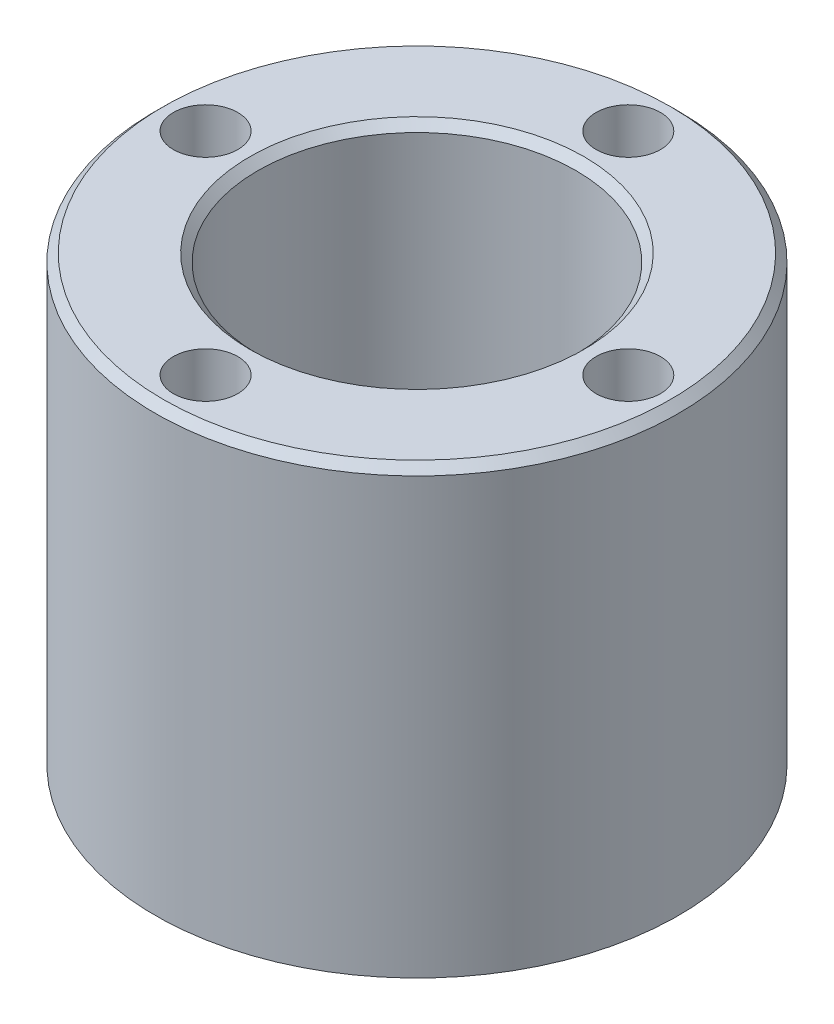
ISO-10303-21;
HEADER;
FILE_DESCRIPTION(('STEP AP214'),'2;1');
FILE_NAME('part.step','',(''),(''),'','','');
FILE_SCHEMA(('AUTOMOTIVE_DESIGN { 1 0 10303 214 1 1 1 1 }'));
ENDSEC;
DATA;
#1=APPLICATION_CONTEXT('core data for automotive mechanical design processes');
#2=APPLICATION_PROTOCOL_DEFINITION('international standard','automotive_design',2000,#1);
#3=PRODUCT_CONTEXT('',#1,'mechanical');
#4=PRODUCT('Part','Part','',(#3));
#5=PRODUCT_RELATED_PRODUCT_CATEGORY('part','',(#4));
#6=PRODUCT_DEFINITION_FORMATION('','',#4);
#7=PRODUCT_DEFINITION_CONTEXT('part definition',#1,'design');
#8=PRODUCT_DEFINITION('design','',#6,#7);
#9=PRODUCT_DEFINITION_SHAPE('','',#8);
#10=(LENGTH_UNIT() NAMED_UNIT(*) SI_UNIT(.MILLI.,.METRE.));
#11=(NAMED_UNIT(*) PLANE_ANGLE_UNIT() SI_UNIT($,.RADIAN.));
#12=(NAMED_UNIT(*) SI_UNIT($,.STERADIAN.) SOLID_ANGLE_UNIT());
#13=UNCERTAINTY_MEASURE_WITH_UNIT(LENGTH_MEASURE(1.E-05),#10,'distance_accuracy_value','');
#14=(GEOMETRIC_REPRESENTATION_CONTEXT(3) GLOBAL_UNCERTAINTY_ASSIGNED_CONTEXT((#13)) GLOBAL_UNIT_ASSIGNED_CONTEXT((#10,
#11,#12)) REPRESENTATION_CONTEXT('',''));
#15=CARTESIAN_POINT('',(0.,0.,0.));
#16=DIRECTION('',(0.,0.,1.));
#17=DIRECTION('',(1.,0.,0.));
#18=AXIS2_PLACEMENT_3D('',#15,#16,#17);
#19=CARTESIAN_POINT('',(0.,85.,-52.5));
#20=DIRECTION('',(0.,-1.,0.));
#21=DIRECTION('',(0.,0.,-1.));
#22=AXIS2_PLACEMENT_3D('',#19,#20,#21);
#23=PLANE('',#22);
#24=CARTESIAN_POINT('',(0.,85.,-52.5));
#25=DIRECTION('',(0.,1.,0.));
#26=DIRECTION('',(0.,0.,1.));
#27=AXIS2_PLACEMENT_3D('',#24,#25,#26);
#28=CIRCLE('',#27,8.00000000000001);
#29=CARTESIAN_POINT('',(0.,85.,-44.5));
#30=VERTEX_POINT('',#29);
#31=EDGE_CURVE('E18',#30,#30,#28,.T.);
#32=ORIENTED_EDGE('',*,*,#31,.T.);
#33=EDGE_LOOP('',(#32));
#34=FACE_BOUND('',#33,.T.);
#35=ADVANCED_FACE('F15',(#34),#23,.F.);
#36=CARTESIAN_POINT('',(52.5,85.,1.83302876458243E-13));
#37=DIRECTION('',(0.,-1.,0.));
#38=DIRECTION('',(0.,0.,-1.));
#39=AXIS2_PLACEMENT_3D('',#36,#37,#38);
#40=PLANE('',#39);
#41=CARTESIAN_POINT('',(52.5,85.,1.83302876458243E-13));
#42=DIRECTION('',(0.,1.,0.));
#43=DIRECTION('',(0.,0.,1.));
#44=AXIS2_PLACEMENT_3D('',#41,#42,#43);
#45=CIRCLE('',#44,8.00000000000001);
#46=CARTESIAN_POINT('',(52.5,85.,8.00000000000019));
#47=VERTEX_POINT('',#46);
#48=EDGE_CURVE('E57',#47,#47,#45,.T.);
#49=ORIENTED_EDGE('',*,*,#48,.T.);
#50=EDGE_LOOP('',(#49));
#51=FACE_BOUND('',#50,.T.);
#52=ADVANCED_FACE('F123',(#51),#40,.F.);
#53=CARTESIAN_POINT('',(-3.66605752916485E-13,85.,52.5));
#54=DIRECTION('',(0.,-1.,0.));
#55=DIRECTION('',(0.,0.,-1.));
#56=AXIS2_PLACEMENT_3D('',#53,#54,#55);
#57=PLANE('',#56);
#58=CARTESIAN_POINT('',(-3.66605752916485E-13,85.,52.5));
#59=DIRECTION('',(0.,1.,0.));
#60=DIRECTION('',(0.,0.,1.));
#61=AXIS2_PLACEMENT_3D('',#58,#59,#60);
#62=CIRCLE('',#61,8.00000000000001);
#63=CARTESIAN_POINT('',(-3.66605752916485E-13,85.,60.5));
#64=VERTEX_POINT('',#63);
#65=EDGE_CURVE('E55',#64,#64,#62,.T.);
#66=ORIENTED_EDGE('',*,*,#65,.T.);
#67=EDGE_LOOP('',(#66));
#68=FACE_BOUND('',#67,.T.);
#69=ADVANCED_FACE('F79',(#68),#57,.F.);
#70=CARTESIAN_POINT('',(-52.5,85.,-5.49908629374728E-13));
#71=DIRECTION('',(0.,-1.,0.));
#72=DIRECTION('',(0.,0.,-1.));
#73=AXIS2_PLACEMENT_3D('',#70,#71,#72);
#74=PLANE('',#73);
#75=CARTESIAN_POINT('',(-52.5,85.,-5.49908629374728E-13));
#76=DIRECTION('',(0.,1.,0.));
#77=DIRECTION('',(0.,0.,1.));
#78=AXIS2_PLACEMENT_3D('',#75,#76,#77);
#79=CIRCLE('',#78,8.00000000000001);
#80=CARTESIAN_POINT('',(-52.5,85.,7.99999999999946));
#81=VERTEX_POINT('',#80);
#82=EDGE_CURVE('E52',#81,#81,#79,.T.);
#83=ORIENTED_EDGE('',*,*,#82,.T.);
#84=EDGE_LOOP('',(#83));
#85=FACE_BOUND('',#84,.T.);
#86=ADVANCED_FACE('F68',(#85),#74,.F.);
#87=CARTESIAN_POINT('',(0.,110.,-52.5));
#88=DIRECTION('',(0.,1.,0.));
#89=DIRECTION('',(0.,0.,1.));
#90=AXIS2_PLACEMENT_3D('',#87,#88,#89);
#91=CYLINDRICAL_SURFACE('',#90,8.00000000000001);
#92=CARTESIAN_POINT('',(0.,110.,-52.5));
#93=DIRECTION('',(0.,1.,0.));
#94=DIRECTION('',(0.,0.,1.));
#95=AXIS2_PLACEMENT_3D('',#92,#93,#94);
#96=CIRCLE('',#95,8.00000000000001);
#97=CARTESIAN_POINT('',(0.,110.,-44.5));
#98=VERTEX_POINT('',#97);
#99=EDGE_CURVE('E46',#98,#98,#96,.F.);
#100=ORIENTED_EDGE('',*,*,#99,.F.);
#101=EDGE_LOOP('',(#100));
#102=FACE_BOUND('',#101,.T.);
#103=ORIENTED_EDGE('',*,*,#31,.F.);
#104=EDGE_LOOP('',(#103));
#105=FACE_BOUND('',#104,.T.);
#106=ADVANCED_FACE('F65',(#102,#105),#91,.F.);
#107=CARTESIAN_POINT('',(52.5,110.,1.83302876458243E-13));
#108=DIRECTION('',(0.,1.,0.));
#109=DIRECTION('',(0.,0.,1.));
#110=AXIS2_PLACEMENT_3D('',#107,#108,#109);
#111=CYLINDRICAL_SURFACE('',#110,8.00000000000001);
#112=CARTESIAN_POINT('',(52.5,110.,1.83302876458243E-13));
#113=DIRECTION('',(0.,1.,0.));
#114=DIRECTION('',(0.,0.,1.));
#115=AXIS2_PLACEMENT_3D('',#112,#113,#114);
#116=CIRCLE('',#115,8.00000000000001);
#117=CARTESIAN_POINT('',(52.5,110.,8.00000000000019));
#118=VERTEX_POINT('',#117);
#119=EDGE_CURVE('E43',#118,#118,#116,.F.);
#120=ORIENTED_EDGE('',*,*,#119,.F.);
#121=EDGE_LOOP('',(#120));
#122=FACE_BOUND('',#121,.T.);
#123=ORIENTED_EDGE('',*,*,#48,.F.);
#124=EDGE_LOOP('',(#123));
#125=FACE_BOUND('',#124,.T.);
#126=ADVANCED_FACE('F67',(#122,#125),#111,.F.);
#127=CARTESIAN_POINT('',(-3.66605752916485E-13,110.,52.5));
#128=DIRECTION('',(0.,1.,0.));
#129=DIRECTION('',(0.,0.,1.));
#130=AXIS2_PLACEMENT_3D('',#127,#128,#129);
#131=CYLINDRICAL_SURFACE('',#130,8.00000000000001);
#132=CARTESIAN_POINT('',(-3.66605752916485E-13,110.,52.5));
#133=DIRECTION('',(0.,1.,0.));
#134=DIRECTION('',(0.,0.,1.));
#135=AXIS2_PLACEMENT_3D('',#132,#133,#134);
#136=CIRCLE('',#135,8.00000000000001);
#137=CARTESIAN_POINT('',(-3.66605752916485E-13,110.,60.5));
#138=VERTEX_POINT('',#137);
#139=EDGE_CURVE('E40',#138,#138,#136,.F.);
#140=ORIENTED_EDGE('',*,*,#139,.F.);
#141=EDGE_LOOP('',(#140));
#142=FACE_BOUND('',#141,.T.);
#143=ORIENTED_EDGE('',*,*,#65,.F.);
#144=EDGE_LOOP('',(#143));
#145=FACE_BOUND('',#144,.T.);
#146=ADVANCED_FACE('F76',(#142,#145),#131,.F.);
#147=CARTESIAN_POINT('',(-52.5,110.,-5.49908629374728E-13));
#148=DIRECTION('',(0.,1.,0.));
#149=DIRECTION('',(0.,0.,1.));
#150=AXIS2_PLACEMENT_3D('',#147,#148,#149);
#151=CYLINDRICAL_SURFACE('',#150,8.00000000000001);
#152=CARTESIAN_POINT('',(-52.5,110.,-5.49908629374728E-13));
#153=DIRECTION('',(0.,1.,0.));
#154=DIRECTION('',(0.,0.,1.));
#155=AXIS2_PLACEMENT_3D('',#152,#153,#154);
#156=CIRCLE('',#155,8.00000000000001);
#157=CARTESIAN_POINT('',(-52.5,110.,7.99999999999946));
#158=VERTEX_POINT('',#157);
#159=EDGE_CURVE('E37',#158,#158,#156,.F.);
#160=ORIENTED_EDGE('',*,*,#159,.F.);
#161=EDGE_LOOP('',(#160));
#162=FACE_BOUND('',#161,.T.);
#163=ORIENTED_EDGE('',*,*,#82,.F.);
#164=EDGE_LOOP('',(#163));
#165=FACE_BOUND('',#164,.T.);
#166=ADVANCED_FACE('F109',(#162,#165),#151,.F.);
#167=CARTESIAN_POINT('',(0.,110.,0.));
#168=DIRECTION('',(0.,1.,0.));
#169=DIRECTION('',(0.,0.,1.));
#170=AXIS2_PLACEMENT_3D('',#167,#168,#169);
#171=CONICAL_SURFACE('',#170,41.5,0.78539816339745);
#172=CARTESIAN_POINT('',(0.,110.,0.));
#173=DIRECTION('',(0.,1.,0.));
#174=DIRECTION('',(0.,0.,1.));
#175=AXIS2_PLACEMENT_3D('',#172,#173,#174);
#176=CIRCLE('',#175,41.5);
#177=CARTESIAN_POINT('',(0.,110.,41.5));
#178=VERTEX_POINT('',#177);
#179=EDGE_CURVE('E49',#178,#178,#176,.F.);
#180=ORIENTED_EDGE('',*,*,#179,.F.);
#181=EDGE_LOOP('',(#180));
#182=FACE_BOUND('',#181,.T.);
#183=CARTESIAN_POINT('',(0.,108.,0.));
#184=DIRECTION('',(0.,-1.,0.));
#185=DIRECTION('',(0.,0.,-1.));
#186=AXIS2_PLACEMENT_3D('',#183,#184,#185);
#187=CIRCLE('',#186,39.5);
#188=CARTESIAN_POINT('',(0.,108.,-39.5));
#189=VERTEX_POINT('',#188);
#190=EDGE_CURVE('E31',#189,#189,#187,.T.);
#191=ORIENTED_EDGE('',*,*,#190,.T.);
#192=EDGE_LOOP('',(#191));
#193=FACE_BOUND('',#192,.T.);
#194=ADVANCED_FACE('F105',(#182,#193),#171,.F.);
#195=CARTESIAN_POINT('',(0.,110.,0.));
#196=DIRECTION('',(0.,1.,0.));
#197=DIRECTION('',(0.,0.,1.));
#198=AXIS2_PLACEMENT_3D('',#195,#196,#197);
#199=PLANE('',#198);
#200=ORIENTED_EDGE('',*,*,#159,.T.);
#201=EDGE_LOOP('',(#200));
#202=FACE_BOUND('',#201,.T.);
#203=ORIENTED_EDGE('',*,*,#139,.T.);
#204=EDGE_LOOP('',(#203));
#205=FACE_BOUND('',#204,.T.);
#206=ORIENTED_EDGE('',*,*,#119,.T.);
#207=EDGE_LOOP('',(#206));
#208=FACE_BOUND('',#207,.T.);
#209=ORIENTED_EDGE('',*,*,#99,.T.);
#210=EDGE_LOOP('',(#209));
#211=FACE_BOUND('',#210,.T.);
#212=CARTESIAN_POINT('',(0.,110.,0.));
#213=DIRECTION('',(0.,-1.,0.));
#214=DIRECTION('',(0.,0.,-1.));
#215=AXIS2_PLACEMENT_3D('',#212,#213,#214);
#216=CIRCLE('',#215,63.);
#217=CARTESIAN_POINT('',(0.,110.,-63.));
#218=VERTEX_POINT('',#217);
#219=EDGE_CURVE('E34',#218,#218,#216,.T.);
#220=ORIENTED_EDGE('',*,*,#219,.F.);
#221=EDGE_LOOP('',(#220));
#222=FACE_BOUND('',#221,.T.);
#223=ORIENTED_EDGE('',*,*,#179,.T.);
#224=EDGE_LOOP('',(#223));
#225=FACE_BOUND('',#224,.T.);
#226=ADVANCED_FACE('F101',(#202,#205,#208,#211,#222,#225),#199,.T.);
#227=CARTESIAN_POINT('',(0.,110.,0.));
#228=DIRECTION('',(0.,-1.,0.));
#229=DIRECTION('',(0.,0.,-1.));
#230=AXIS2_PLACEMENT_3D('',#227,#228,#229);
#231=CYLINDRICAL_SURFACE('',#230,39.5);
#232=CARTESIAN_POINT('',(0.,0.,0.));
#233=DIRECTION('',(0.,-1.,0.));
#234=DIRECTION('',(0.,0.,-1.));
#235=AXIS2_PLACEMENT_3D('',#232,#233,#234);
#236=CIRCLE('',#235,39.5);
#237=CARTESIAN_POINT('',(0.,0.,-39.5));
#238=VERTEX_POINT('',#237);
#239=EDGE_CURVE('E27',#238,#238,#236,.T.);
#240=ORIENTED_EDGE('',*,*,#239,.T.);
#241=EDGE_LOOP('',(#240));
#242=FACE_BOUND('',#241,.T.);
#243=ORIENTED_EDGE('',*,*,#190,.F.);
#244=EDGE_LOOP('',(#243));
#245=FACE_BOUND('',#244,.T.);
#246=ADVANCED_FACE('F97',(#242,#245),#231,.F.);
#247=CARTESIAN_POINT('',(0.,108.,0.));
#248=DIRECTION('',(0.,-1.,0.));
#249=DIRECTION('',(0.,0.,-1.));
#250=AXIS2_PLACEMENT_3D('',#247,#248,#249);
#251=CONICAL_SURFACE('',#250,65.,0.785398163397438);
#252=CARTESIAN_POINT('',(0.,108.,0.));
#253=DIRECTION('',(0.,-1.,0.));
#254=DIRECTION('',(0.,0.,-1.));
#255=AXIS2_PLACEMENT_3D('',#252,#253,#254);
#256=CIRCLE('',#255,65.);
#257=CARTESIAN_POINT('',(0.,108.,-65.));
#258=VERTEX_POINT('',#257);
#259=EDGE_CURVE('E22',#258,#258,#256,.T.);
#260=ORIENTED_EDGE('',*,*,#259,.F.);
#261=EDGE_LOOP('',(#260));
#262=FACE_BOUND('',#261,.T.);
#263=ORIENTED_EDGE('',*,*,#219,.T.);
#264=EDGE_LOOP('',(#263));
#265=FACE_BOUND('',#264,.T.);
#266=ADVANCED_FACE('F90',(#262,#265),#251,.T.);
#267=CARTESIAN_POINT('',(0.,0.,0.));
#268=DIRECTION('',(0.,1.,0.));
#269=DIRECTION('',(0.,0.,1.));
#270=AXIS2_PLACEMENT_3D('',#267,#268,#269);
#271=PLANE('',#270);
#272=ORIENTED_EDGE('',*,*,#239,.F.);
#273=EDGE_LOOP('',(#272));
#274=FACE_BOUND('',#273,.T.);
#275=CARTESIAN_POINT('',(0.,0.,0.));
#276=DIRECTION('',(0.,-1.,0.));
#277=DIRECTION('',(0.,0.,-1.));
#278=AXIS2_PLACEMENT_3D('',#275,#276,#277);
#279=CIRCLE('',#278,65.);
#280=CARTESIAN_POINT('',(0.,0.,-65.));
#281=VERTEX_POINT('',#280);
#282=EDGE_CURVE('E10',#281,#281,#279,.F.);
#283=ORIENTED_EDGE('',*,*,#282,.F.);
#284=EDGE_LOOP('',(#283));
#285=FACE_BOUND('',#284,.T.);
#286=ADVANCED_FACE('F85',(#274,#285),#271,.F.);
#287=CARTESIAN_POINT('',(0.,110.,0.));
#288=DIRECTION('',(0.,-1.,0.));
#289=DIRECTION('',(0.,0.,-1.));
#290=AXIS2_PLACEMENT_3D('',#287,#288,#289);
#291=CYLINDRICAL_SURFACE('',#290,65.);
#292=ORIENTED_EDGE('',*,*,#282,.T.);
#293=EDGE_LOOP('',(#292));
#294=FACE_BOUND('',#293,.T.);
#295=ORIENTED_EDGE('',*,*,#259,.T.);
#296=EDGE_LOOP('',(#295));
#297=FACE_BOUND('',#296,.T.);
#298=ADVANCED_FACE('F83',(#294,#297),#291,.T.);
#299=CLOSED_SHELL('',(#35,#52,#69,#86,#106,#126,#146,#166,#194,#226,#246,#266,#286,#298));
#300=MANIFOLD_SOLID_BREP('B1',#299);
#301=ADVANCED_BREP_SHAPE_REPRESENTATION('',(#18,#300),#14);
#302=SHAPE_DEFINITION_REPRESENTATION(#9,#301);
ENDSEC;
END-ISO-10303-21;
